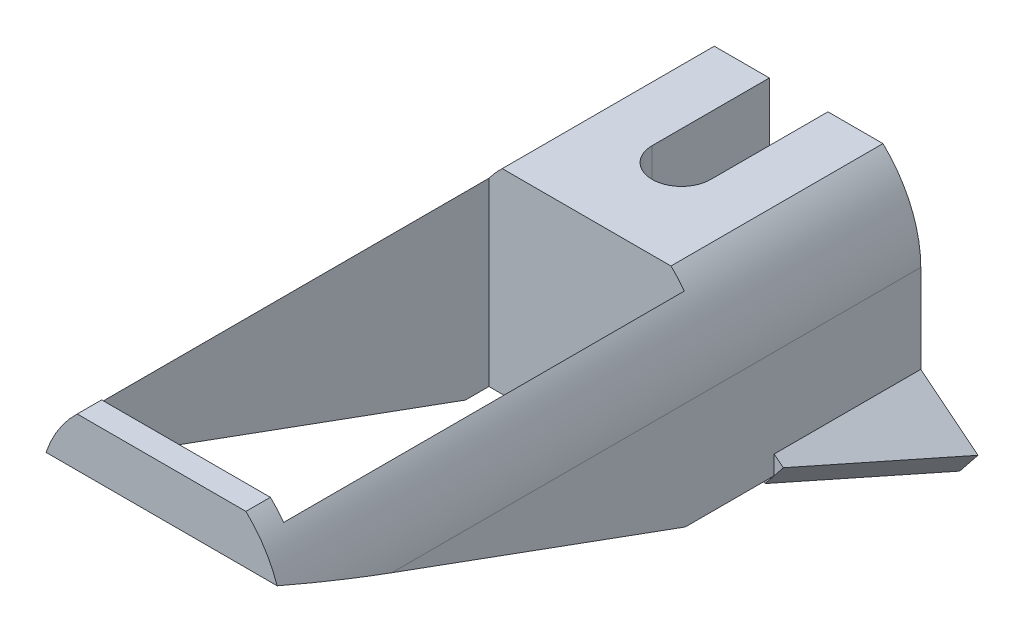
ISO-10303-21;
HEADER;
FILE_DESCRIPTION(('STEP AP214'),'2;1');
FILE_NAME('part.step','',(''),(''),'','','');
FILE_SCHEMA(('AUTOMOTIVE_DESIGN { 1 0 10303 214 1 1 1 1 }'));
ENDSEC;
DATA;
#1=APPLICATION_CONTEXT('core data for automotive mechanical design processes');
#2=APPLICATION_PROTOCOL_DEFINITION('international standard','automotive_design',2000,#1);
#3=PRODUCT_CONTEXT('',#1,'mechanical');
#4=PRODUCT('Part','Part','',(#3));
#5=PRODUCT_RELATED_PRODUCT_CATEGORY('part','',(#4));
#6=PRODUCT_DEFINITION_FORMATION('','',#4);
#7=PRODUCT_DEFINITION_CONTEXT('part definition',#1,'design');
#8=PRODUCT_DEFINITION('design','',#6,#7);
#9=PRODUCT_DEFINITION_SHAPE('','',#8);
#10=(LENGTH_UNIT() NAMED_UNIT(*) SI_UNIT(.MILLI.,.METRE.));
#11=(NAMED_UNIT(*) PLANE_ANGLE_UNIT() SI_UNIT($,.RADIAN.));
#12=(NAMED_UNIT(*) SI_UNIT($,.STERADIAN.) SOLID_ANGLE_UNIT());
#13=UNCERTAINTY_MEASURE_WITH_UNIT(LENGTH_MEASURE(1.E-05),#10,'distance_accuracy_value','');
#14=(GEOMETRIC_REPRESENTATION_CONTEXT(3) GLOBAL_UNCERTAINTY_ASSIGNED_CONTEXT((#13)) GLOBAL_UNIT_ASSIGNED_CONTEXT((#10,
#11,#12)) REPRESENTATION_CONTEXT('',''));
#15=CARTESIAN_POINT('',(0.,0.,0.));
#16=DIRECTION('',(0.,0.,1.));
#17=DIRECTION('',(1.,0.,0.));
#18=AXIS2_PLACEMENT_3D('',#15,#16,#17);
#19=CARTESIAN_POINT('',(0.,20.,21.7));
#20=DIRECTION('',(0.,-1.,0.));
#21=DIRECTION('',(0.,0.,-1.));
#22=AXIS2_PLACEMENT_3D('',#19,#20,#21);
#23=PLANE('',#22);
#24=DIRECTION('',(-1.,0.,0.));
#25=VECTOR('',#24,1.);
#26=CARTESIAN_POINT('',(0.,20.,65.2));
#27=LINE('',#26,#25);
#28=CARTESIAN_POINT('',(21.1334739654613,20.,65.2));
#29=VERTEX_POINT('',#28);
#30=CARTESIAN_POINT('',(3.86652603453867,20.,65.2));
#31=VERTEX_POINT('',#30);
#32=EDGE_CURVE('E419',#29,#31,#27,.T.);
#33=ORIENTED_EDGE('',*,*,#32,.F.);
#34=DIRECTION('',(0.,0.,-1.));
#35=VECTOR('',#34,1.);
#36=CARTESIAN_POINT('',(21.1334739654613,20.,65.201));
#37=LINE('',#36,#35);
#38=CARTESIAN_POINT('',(21.1334739654613,20.,62.7));
#39=VERTEX_POINT('',#38);
#40=EDGE_CURVE('E215',#39,#29,#37,.F.);
#41=ORIENTED_EDGE('',*,*,#40,.F.);
#42=DIRECTION('',(-1.,0.,0.));
#43=VECTOR('',#42,1.);
#44=CARTESIAN_POINT('',(0.,20.,62.7));
#45=LINE('',#44,#43);
#46=CARTESIAN_POINT('',(3.86652603453867,20.,62.7));
#47=VERTEX_POINT('',#46);
#48=EDGE_CURVE('E409',#39,#47,#45,.T.);
#49=ORIENTED_EDGE('',*,*,#48,.T.);
#50=DIRECTION('',(0.,0.,-1.));
#51=VECTOR('',#50,1.);
#52=CARTESIAN_POINT('',(3.86652603453867,20.,65.201));
#53=LINE('',#52,#51);
#54=EDGE_CURVE('E281',#31,#47,#53,.T.);
#55=ORIENTED_EDGE('',*,*,#54,.F.);
#56=EDGE_LOOP('',(#33,#41,#49,#55));
#57=FACE_BOUND('',#56,.T.);
#58=ADVANCED_FACE('F33',(#57),#23,.F.);
#59=CARTESIAN_POINT('',(0.,0.,21.7));
#60=DIRECTION('',(1.,0.,0.));
#61=DIRECTION('',(0.,0.,-1.));
#62=AXIS2_PLACEMENT_3D('',#59,#60,#61);
#63=PLANE('',#62);
#64=DIRECTION('',(0.,0.,1.));
#65=VECTOR('',#64,1.);
#66=CARTESIAN_POINT('',(0.,10.9604686356149,65.201));
#67=LINE('',#66,#65);
#68=CARTESIAN_POINT('',(0.,10.9604686356149,0.));
#69=VERTEX_POINT('',#68);
#70=CARTESIAN_POINT('',(0.,10.9604686356149,54.1316840615849));
#71=VERTEX_POINT('',#70);
#72=EDGE_CURVE('E58',#69,#71,#67,.T.);
#73=ORIENTED_EDGE('',*,*,#72,.F.);
#74=DIRECTION('',(0.,-1.,0.));
#75=VECTOR('',#74,1.);
#76=CARTESIAN_POINT('',(0.,0.,0.));
#77=LINE('',#76,#75);
#78=CARTESIAN_POINT('',(0.,1.92093727122986,0.));
#79=VERTEX_POINT('',#78);
#80=EDGE_CURVE('E253',#69,#79,#77,.T.);
#81=ORIENTED_EDGE('',*,*,#80,.T.);
#82=DIRECTION('',(0.,0.,-1.));
#83=VECTOR('',#82,1.);
#84=CARTESIAN_POINT('',(0.,1.92093727122986,15.));
#85=LINE('',#84,#83);
#86=CARTESIAN_POINT('',(0.,1.92093727122986,15.));
#87=VERTEX_POINT('',#86);
#88=EDGE_CURVE('E327',#87,#79,#85,.T.);
#89=ORIENTED_EDGE('',*,*,#88,.F.);
#90=DIRECTION('',(0.,1.,0.));
#91=VECTOR('',#90,1.);
#92=CARTESIAN_POINT('',(0.,0.,15.));
#93=LINE('',#92,#91);
#94=CARTESIAN_POINT('',(0.,0.,15.));
#95=VERTEX_POINT('',#94);
#96=EDGE_CURVE('E339',#95,#87,#93,.T.);
#97=ORIENTED_EDGE('',*,*,#96,.F.);
#98=DIRECTION('',(0.,0.,-1.));
#99=VECTOR('',#98,1.);
#100=CARTESIAN_POINT('',(0.,0.,21.7));
#101=LINE('',#100,#99);
#102=CARTESIAN_POINT('',(0.,0.,24.1));
#103=VERTEX_POINT('',#102);
#104=EDGE_CURVE('E234',#103,#95,#101,.T.);
#105=ORIENTED_EDGE('',*,*,#104,.F.);
#106=DIRECTION('',(0.,0.34284393312498,0.939392376762444));
#107=VECTOR('',#106,1.);
#108=CARTESIAN_POINT('',(0.,-0.772955945272458,21.9821007099534));
#109=LINE('',#108,#107);
#110=EDGE_CURVE('E384',#103,#71,#109,.T.);
#111=ORIENTED_EDGE('',*,*,#110,.T.);
#112=EDGE_LOOP('',(#73,#81,#89,#97,#105,#111));
#113=FACE_BOUND('',#112,.T.);
#114=ADVANCED_FACE('F35',(#113),#63,.F.);
#115=CARTESIAN_POINT('',(0.,0.,0.));
#116=DIRECTION('',(0.,0.,-1.));
#117=DIRECTION('',(-1.,0.,0.));
#118=AXIS2_PLACEMENT_3D('',#115,#116,#117);
#119=PLANE('',#118);
#120=CARTESIAN_POINT('',(12.5,10.9604686356149,0.));
#121=DIRECTION('',(0.,0.,1.));
#122=DIRECTION('',(-1.,0.,0.));
#123=AXIS2_PLACEMENT_3D('',#120,#121,#122);
#124=CIRCLE('',#123,12.5);
#125=CARTESIAN_POINT('',(3.86652603453867,20.,0.));
#126=VERTEX_POINT('',#125);
#127=EDGE_CURVE('E275',#126,#69,#124,.T.);
#128=ORIENTED_EDGE('',*,*,#127,.F.);
#129=DIRECTION('',(-1.,0.,0.));
#130=VECTOR('',#129,1.);
#131=CARTESIAN_POINT('',(0.,20.,0.));
#132=LINE('',#131,#130);
#133=CARTESIAN_POINT('',(9.49999999999999,20.,0.));
#134=VERTEX_POINT('',#133);
#135=EDGE_CURVE('E240',#134,#126,#132,.T.);
#136=ORIENTED_EDGE('',*,*,#135,.F.);
#137=DIRECTION('',(0.,1.,0.));
#138=VECTOR('',#137,1.);
#139=CARTESIAN_POINT('',(9.49999999999999,0.,0.));
#140=LINE('',#139,#138);
#141=CARTESIAN_POINT('',(9.49999999999999,0.,0.));
#142=VERTEX_POINT('',#141);
#143=EDGE_CURVE('E11',#142,#134,#140,.T.);
#144=ORIENTED_EDGE('',*,*,#143,.F.);
#145=DIRECTION('',(1.,0.,0.));
#146=VECTOR('',#145,1.);
#147=CARTESIAN_POINT('',(0.,0.,0.));
#148=LINE('',#147,#146);
#149=CARTESIAN_POINT('',(2.40117158903732,0.,0.));
#150=VERTEX_POINT('',#149);
#151=EDGE_CURVE('E257',#150,#142,#148,.T.);
#152=ORIENTED_EDGE('',*,*,#151,.F.);
#153=DIRECTION('',(0.78086880944303,0.624695047554424,0.));
#154=VECTOR('',#153,1.);
#155=CARTESIAN_POINT('',(1.87408514266327,-0.421669157099234,0.));
#156=LINE('',#155,#154);
#157=CARTESIAN_POINT('',(-3.98243092815945,-5.10688201375742,0.));
#158=VERTEX_POINT('',#157);
#159=EDGE_CURVE('E320',#158,#150,#156,.T.);
#160=ORIENTED_EDGE('',*,*,#159,.F.);
#161=DIRECTION('',(0.624695047554424,-0.78086880944303,0.));
#162=VECTOR('',#161,1.);
#163=CARTESIAN_POINT('',(-5.85651607082273,-2.76427558542832,0.));
#164=LINE('',#163,#162);
#165=CARTESIAN_POINT('',(-5.85651607082273,-2.76427558542832,0.));
#166=VERTEX_POINT('',#165);
#167=EDGE_CURVE('E330',#166,#158,#164,.T.);
#168=ORIENTED_EDGE('',*,*,#167,.F.);
#169=DIRECTION('',(-0.78086880944303,-0.624695047554424,0.));
#170=VECTOR('',#169,1.);
#171=CARTESIAN_POINT('',(0.,1.92093727122986,0.));
#172=LINE('',#171,#170);
#173=EDGE_CURVE('E324',#79,#166,#172,.T.);
#174=ORIENTED_EDGE('',*,*,#173,.F.);
#175=ORIENTED_EDGE('',*,*,#80,.F.);
#176=EDGE_LOOP('',(#128,#136,#144,#152,#160,#168,#174,#175));
#177=FACE_BOUND('',#176,.T.);
#178=CARTESIAN_POINT('',(2.5,5.,0.));
#179=DIRECTION('',(0.,0.,-1.));
#180=DIRECTION('',(-1.,0.,0.));
#181=AXIS2_PLACEMENT_3D('',#178,#179,#180);
#182=CIRCLE('',#181,2.);
#183=CARTESIAN_POINT('',(0.5,5.,0.));
#184=VERTEX_POINT('',#183);
#185=EDGE_CURVE('E391',#184,#184,#182,.T.);
#186=ORIENTED_EDGE('',*,*,#185,.F.);
#187=EDGE_LOOP('',(#186));
#188=FACE_BOUND('',#187,.T.);
#189=ADVANCED_FACE('F272',(#177,#188),#119,.T.);
#190=CARTESIAN_POINT('',(25.,0.,15.));
#191=DIRECTION('',(0.,0.,-1.));
#192=DIRECTION('',(1.,0.,0.));
#193=AXIS2_PLACEMENT_3D('',#190,#191,#192);
#194=PLANE('',#193);
#195=DIRECTION('',(0.624695047554425,-0.78086880944303,0.));
#196=VECTOR('',#195,1.);
#197=CARTESIAN_POINT('',(-8.43338314198473,10.5417289274809,15.));
#198=LINE('',#197,#196);
#199=CARTESIAN_POINT('',(0.937042571331634,-1.17130321416455,15.));
#200=VERTEX_POINT('',#199);
#201=EDGE_CURVE('E314',#95,#200,#198,.T.);
#202=ORIENTED_EDGE('',*,*,#201,.T.);
#203=DIRECTION('',(0.78086880944303,0.624695047554424,0.));
#204=VECTOR('',#203,1.);
#205=CARTESIAN_POINT('',(1.87408514266327,-0.421669157099234,15.));
#206=LINE('',#205,#204);
#207=CARTESIAN_POINT('',(2.40117158903732,0.,15.));
#208=VERTEX_POINT('',#207);
#209=EDGE_CURVE('E321',#200,#208,#206,.T.);
#210=ORIENTED_EDGE('',*,*,#209,.T.);
#211=DIRECTION('',(-1.,0.,0.));
#212=VECTOR('',#211,1.);
#213=CARTESIAN_POINT('',(0.,0.,15.));
#214=LINE('',#213,#212);
#215=EDGE_CURVE('E477',#208,#95,#214,.T.);
#216=ORIENTED_EDGE('',*,*,#215,.T.);
#217=EDGE_LOOP('',(#202,#210,#216));
#218=FACE_BOUND('',#217,.T.);
#219=ADVANCED_FACE('F673',(#218),#194,.F.);
#220=CARTESIAN_POINT('',(-0.937042571331644,1.17130321416455,15.));
#221=VERTEX_POINT('',#220);
#222=EDGE_CURVE('E317',#221,#95,#198,.T.);
#223=ORIENTED_EDGE('',*,*,#222,.T.);
#224=ORIENTED_EDGE('',*,*,#96,.T.);
#225=DIRECTION('',(-0.78086880944303,-0.624695047554424,0.));
#226=VECTOR('',#225,1.);
#227=CARTESIAN_POINT('',(0.,1.92093727122986,15.));
#228=LINE('',#227,#226);
#229=EDGE_CURVE('E323',#87,#221,#228,.T.);
#230=ORIENTED_EDGE('',*,*,#229,.T.);
#231=EDGE_LOOP('',(#223,#224,#230));
#232=FACE_BOUND('',#231,.T.);
#233=ADVANCED_FACE('F675',(#232),#194,.F.);
#234=CARTESIAN_POINT('',(1.87408514266327,-0.421669157099234,15.));
#235=DIRECTION('',(-0.624695047554424,0.78086880944303,0.));
#236=DIRECTION('',(-0.78086880944303,-0.624695047554424,0.));
#237=AXIS2_PLACEMENT_3D('',#234,#235,#236);
#238=PLANE('',#237);
#239=DIRECTION('',(-0.302377769036027,-0.241902215228822,-0.921982105607361));
#240=VECTOR('',#239,1.);
#241=CARTESIAN_POINT('',(0.937042571331634,-1.17130321416455,15.));
#242=LINE('',#241,#240);
#243=EDGE_CURVE('E311',#200,#158,#242,.T.);
#244=ORIENTED_EDGE('',*,*,#243,.T.);
#245=ORIENTED_EDGE('',*,*,#159,.T.);
#246=DIRECTION('',(0.,0.,1.));
#247=VECTOR('',#246,1.);
#248=CARTESIAN_POINT('',(2.40117158903732,0.,21.7));
#249=LINE('',#248,#247);
#250=EDGE_CURVE('E336',#150,#208,#249,.T.);
#251=ORIENTED_EDGE('',*,*,#250,.T.);
#252=ORIENTED_EDGE('',*,*,#209,.F.);
#253=EDGE_LOOP('',(#244,#245,#251,#252));
#254=FACE_BOUND('',#253,.T.);
#255=ADVANCED_FACE('F541',(#254),#238,.F.);
#256=CARTESIAN_POINT('',(0.,1.92093727122986,15.));
#257=DIRECTION('',(0.624695047554424,-0.78086880944303,0.));
#258=DIRECTION('',(0.78086880944303,0.624695047554425,0.));
#259=AXIS2_PLACEMENT_3D('',#256,#257,#258);
#260=PLANE('',#259);
#261=DIRECTION('',(-0.302377769036027,-0.241902215228822,-0.921982105607362));
#262=VECTOR('',#261,1.);
#263=CARTESIAN_POINT('',(-0.796533977670557,1.28371008909341,15.4284257055423));
#264=LINE('',#263,#262);
#265=EDGE_CURVE('E318',#221,#166,#264,.T.);
#266=ORIENTED_EDGE('',*,*,#265,.F.);
#267=ORIENTED_EDGE('',*,*,#229,.F.);
#268=ORIENTED_EDGE('',*,*,#88,.T.);
#269=ORIENTED_EDGE('',*,*,#173,.T.);
#270=EDGE_LOOP('',(#266,#267,#268,#269));
#271=FACE_BOUND('',#270,.T.);
#272=ADVANCED_FACE('F534',(#271),#260,.F.);
#273=CARTESIAN_POINT('',(0.,0.,21.7));
#274=DIRECTION('',(0.,1.,0.));
#275=DIRECTION('',(0.,0.,1.));
#276=AXIS2_PLACEMENT_3D('',#273,#274,#275);
#277=PLANE('',#276);
#278=CARTESIAN_POINT('',(7.,0.,18.2));
#279=DIRECTION('',(0.,-1.,0.));
#280=DIRECTION('',(0.,0.,-1.));
#281=AXIS2_PLACEMENT_3D('',#278,#279,#280);
#282=CIRCLE('',#281,2.25);
#283=CARTESIAN_POINT('',(7.,0.,15.95));
#284=VERTEX_POINT('',#283);
#285=EDGE_CURVE('E403',#284,#284,#282,.T.);
#286=ORIENTED_EDGE('',*,*,#285,.F.);
#287=EDGE_LOOP('',(#286));
#288=FACE_BOUND('',#287,.T.);
#289=CARTESIAN_POINT('',(18.,0.,18.2));
#290=DIRECTION('',(0.,-1.,0.));
#291=DIRECTION('',(0.,0.,-1.));
#292=AXIS2_PLACEMENT_3D('',#289,#290,#291);
#293=CIRCLE('',#292,2.25);
#294=CARTESIAN_POINT('',(18.,0.,15.95));
#295=VERTEX_POINT('',#294);
#296=EDGE_CURVE('E397',#295,#295,#293,.T.);
#297=ORIENTED_EDGE('',*,*,#296,.F.);
#298=EDGE_LOOP('',(#297));
#299=FACE_BOUND('',#298,.T.);
#300=ORIENTED_EDGE('',*,*,#151,.T.);
#301=DIRECTION('',(0.,0.,-1.));
#302=VECTOR('',#301,1.);
#303=CARTESIAN_POINT('',(9.49999999999999,0.,-11.9912348804847));
#304=LINE('',#303,#302);
#305=CARTESIAN_POINT('',(9.49999999999999,0.,11.9912348804847));
#306=VERTEX_POINT('',#305);
#307=EDGE_CURVE('E303',#306,#142,#304,.T.);
#308=ORIENTED_EDGE('',*,*,#307,.F.);
#309=CARTESIAN_POINT('',(12.5,0.,11.9912348804847));
#310=DIRECTION('',(0.,-1.,0.));
#311=DIRECTION('',(0.,0.,-1.));
#312=AXIS2_PLACEMENT_3D('',#309,#310,#311);
#313=CIRCLE('',#312,3.00000000000001);
#314=CARTESIAN_POINT('',(15.5,0.,11.9912348804847));
#315=VERTEX_POINT('',#314);
#316=EDGE_CURVE('E300',#315,#306,#313,.T.);
#317=ORIENTED_EDGE('',*,*,#316,.F.);
#318=DIRECTION('',(0.,0.,1.));
#319=VECTOR('',#318,1.);
#320=CARTESIAN_POINT('',(15.5,0.,-11.9912348804847));
#321=LINE('',#320,#319);
#322=CARTESIAN_POINT('',(15.5,0.,0.));
#323=VERTEX_POINT('',#322);
#324=EDGE_CURVE('E292',#323,#315,#321,.T.);
#325=ORIENTED_EDGE('',*,*,#324,.F.);
#326=CARTESIAN_POINT('',(22.5988284109627,0.,0.));
#327=VERTEX_POINT('',#326);
#328=EDGE_CURVE('E255',#323,#327,#148,.T.);
#329=ORIENTED_EDGE('',*,*,#328,.T.);
#330=DIRECTION('',(0.,0.,1.));
#331=VECTOR('',#330,1.);
#332=CARTESIAN_POINT('',(22.5988284109627,0.,21.7));
#333=LINE('',#332,#331);
#334=CARTESIAN_POINT('',(22.5988284109627,0.,15.));
#335=VERTEX_POINT('',#334);
#336=EDGE_CURVE('E363',#327,#335,#333,.T.);
#337=ORIENTED_EDGE('',*,*,#336,.T.);
#338=DIRECTION('',(-1.,0.,0.));
#339=VECTOR('',#338,1.);
#340=CARTESIAN_POINT('',(0.,0.,15.));
#341=LINE('',#340,#339);
#342=CARTESIAN_POINT('',(25.,0.,15.));
#343=VERTEX_POINT('',#342);
#344=EDGE_CURVE('E366',#343,#335,#341,.T.);
#345=ORIENTED_EDGE('',*,*,#344,.F.);
#346=DIRECTION('',(0.,0.,-1.));
#347=VECTOR('',#346,1.);
#348=CARTESIAN_POINT('',(25.,0.,21.7));
#349=LINE('',#348,#347);
#350=CARTESIAN_POINT('',(25.,0.,24.1));
#351=VERTEX_POINT('',#350);
#352=EDGE_CURVE('E231',#351,#343,#349,.T.);
#353=ORIENTED_EDGE('',*,*,#352,.F.);
#354=DIRECTION('',(1.,0.,0.));
#355=VECTOR('',#354,1.);
#356=CARTESIAN_POINT('',(-45.,0.,24.1));
#357=LINE('',#356,#355);
#358=CARTESIAN_POINT('',(22.5,0.,24.1));
#359=VERTEX_POINT('',#358);
#360=EDGE_CURVE('E372',#359,#351,#357,.T.);
#361=ORIENTED_EDGE('',*,*,#360,.F.);
#362=DIRECTION('',(0.,0.,-1.));
#363=VECTOR('',#362,1.);
#364=CARTESIAN_POINT('',(22.5,0.,65.2));
#365=LINE('',#364,#363);
#366=CARTESIAN_POINT('',(22.5,0.,21.7));
#367=VERTEX_POINT('',#366);
#368=EDGE_CURVE('E417',#359,#367,#365,.T.);
#369=ORIENTED_EDGE('',*,*,#368,.T.);
#370=DIRECTION('',(1.,0.,0.));
#371=VECTOR('',#370,1.);
#372=CARTESIAN_POINT('',(0.,0.,21.7));
#373=LINE('',#372,#371);
#374=CARTESIAN_POINT('',(2.5,0.,21.7));
#375=VERTEX_POINT('',#374);
#376=EDGE_CURVE('E232',#375,#367,#373,.T.);
#377=ORIENTED_EDGE('',*,*,#376,.F.);
#378=DIRECTION('',(0.,0.,-1.));
#379=VECTOR('',#378,1.);
#380=CARTESIAN_POINT('',(2.5,0.,65.2));
#381=LINE('',#380,#379);
#382=CARTESIAN_POINT('',(2.5,0.,24.1));
#383=VERTEX_POINT('',#382);
#384=EDGE_CURVE('E256',#383,#375,#381,.T.);
#385=ORIENTED_EDGE('',*,*,#384,.F.);
#386=EDGE_CURVE('E377',#103,#383,#357,.T.);
#387=ORIENTED_EDGE('',*,*,#386,.F.);
#388=ORIENTED_EDGE('',*,*,#104,.T.);
#389=ORIENTED_EDGE('',*,*,#215,.F.);
#390=ORIENTED_EDGE('',*,*,#250,.F.);
#391=EDGE_LOOP('',(#300,#308,#317,#325,#329,#337,#345,#353,#361,#369,#377,#385,#387,#388,#389,#390));
#392=FACE_BOUND('',#391,.T.);
#393=ADVANCED_FACE('F431',(#288,#299,#392),#277,.F.);
#394=CARTESIAN_POINT('',(0.,0.,15.));
#395=DIRECTION('',(0.,0.,-1.));
#396=DIRECTION('',(-1.,0.,0.));
#397=AXIS2_PLACEMENT_3D('',#394,#395,#396);
#398=PLANE('',#397);
#399=DIRECTION('',(-0.78086880944303,0.624695047554424,0.));
#400=VECTOR('',#399,1.);
#401=CARTESIAN_POINT('',(23.1259148573367,-0.421669157099234,15.));
#402=LINE('',#401,#400);
#403=CARTESIAN_POINT('',(24.0629574286684,-1.17130321416455,15.));
#404=VERTEX_POINT('',#403);
#405=EDGE_CURVE('E350',#404,#335,#402,.T.);
#406=ORIENTED_EDGE('',*,*,#405,.F.);
#407=DIRECTION('',(-0.624695047554425,-0.78086880944303,0.));
#408=VECTOR('',#407,1.);
#409=CARTESIAN_POINT('',(33.4333831419847,10.5417289274809,15.));
#410=LINE('',#409,#408);
#411=EDGE_CURVE('E344',#343,#404,#410,.T.);
#412=ORIENTED_EDGE('',*,*,#411,.F.);
#413=ORIENTED_EDGE('',*,*,#344,.T.);
#414=EDGE_LOOP('',(#406,#412,#413));
#415=FACE_BOUND('',#414,.T.);
#416=ADVANCED_FACE('F500',(#415),#398,.F.);
#417=CARTESIAN_POINT('',(2.5,20.,65.2));
#418=DIRECTION('',(-1.,0.,0.));
#419=DIRECTION('',(0.,-1.,0.));
#420=AXIS2_PLACEMENT_3D('',#417,#418,#419);
#421=PLANE('',#420);
#422=DIRECTION('',(0.,1.,0.));
#423=VECTOR('',#422,1.);
#424=CARTESIAN_POINT('',(2.5,20.,21.7));
#425=LINE('',#424,#423);
#426=CARTESIAN_POINT('',(2.5,18.4604686356149,21.7));
#427=VERTEX_POINT('',#426);
#428=EDGE_CURVE('E245',#375,#427,#425,.T.);
#429=ORIENTED_EDGE('',*,*,#428,.T.);
#430=DIRECTION('',(0.,0.,-1.));
#431=VECTOR('',#430,1.);
#432=CARTESIAN_POINT('',(2.5,18.4604686356149,65.201));
#433=LINE('',#432,#431);
#434=CARTESIAN_POINT('',(2.5,18.4604686356149,62.7));
#435=VERTEX_POINT('',#434);
#436=EDGE_CURVE('E289',#435,#427,#433,.T.);
#437=ORIENTED_EDGE('',*,*,#436,.F.);
#438=DIRECTION('',(0.,1.,0.));
#439=VECTOR('',#438,1.);
#440=CARTESIAN_POINT('',(2.5,20.,62.7));
#441=LINE('',#440,#439);
#442=CARTESIAN_POINT('',(2.5,14.0875912408759,62.7));
#443=VERTEX_POINT('',#442);
#444=EDGE_CURVE('E413',#443,#435,#441,.T.);
#445=ORIENTED_EDGE('',*,*,#444,.F.);
#446=DIRECTION('',(0.,-0.34284393312498,-0.939392376762444));
#447=VECTOR('',#446,1.);
#448=CARTESIAN_POINT('',(2.5,15.587709812403,66.8103248859843));
#449=LINE('',#448,#447);
#450=EDGE_CURVE('E381',#443,#383,#449,.T.);
#451=ORIENTED_EDGE('',*,*,#450,.T.);
#452=ORIENTED_EDGE('',*,*,#384,.T.);
#453=EDGE_LOOP('',(#429,#437,#445,#451,#452));
#454=FACE_BOUND('',#453,.T.);
#455=ADVANCED_FACE('F427',(#454),#421,.F.);
#456=CARTESIAN_POINT('',(22.5,20.,65.2));
#457=DIRECTION('',(1.,0.,0.));
#458=DIRECTION('',(0.,1.,0.));
#459=AXIS2_PLACEMENT_3D('',#456,#457,#458);
#460=PLANE('',#459);
#461=DIRECTION('',(0.,-1.,0.));
#462=VECTOR('',#461,1.);
#463=CARTESIAN_POINT('',(22.5,20.,62.7));
#464=LINE('',#463,#462);
#465=CARTESIAN_POINT('',(22.5,18.4604686356149,62.7));
#466=VERTEX_POINT('',#465);
#467=CARTESIAN_POINT('',(22.5,14.0875912408759,62.7));
#468=VERTEX_POINT('',#467);
#469=EDGE_CURVE('E439',#466,#468,#464,.T.);
#470=ORIENTED_EDGE('',*,*,#469,.F.);
#471=DIRECTION('',(0.,0.,-1.));
#472=VECTOR('',#471,1.);
#473=CARTESIAN_POINT('',(22.5,18.4604686356149,65.201));
#474=LINE('',#473,#472);
#475=CARTESIAN_POINT('',(22.5,18.4604686356149,21.7));
#476=VERTEX_POINT('',#475);
#477=EDGE_CURVE('E225',#476,#466,#474,.F.);
#478=ORIENTED_EDGE('',*,*,#477,.F.);
#479=DIRECTION('',(0.,-1.,0.));
#480=VECTOR('',#479,1.);
#481=CARTESIAN_POINT('',(22.5,20.,21.7));
#482=LINE('',#481,#480);
#483=EDGE_CURVE('E224',#476,#367,#482,.T.);
#484=ORIENTED_EDGE('',*,*,#483,.T.);
#485=ORIENTED_EDGE('',*,*,#368,.F.);
#486=DIRECTION('',(0.,0.34284393312498,0.939392376762444));
#487=VECTOR('',#486,1.);
#488=CARTESIAN_POINT('',(22.5,15.587709812403,66.8103248859843));
#489=LINE('',#488,#487);
#490=EDGE_CURVE('E376',#359,#468,#489,.T.);
#491=ORIENTED_EDGE('',*,*,#490,.T.);
#492=EDGE_LOOP('',(#470,#478,#484,#485,#491));
#493=FACE_BOUND('',#492,.T.);
#494=ADVANCED_FACE('F438',(#493),#460,.F.);
#495=CARTESIAN_POINT('',(0.,0.,21.7));
#496=DIRECTION('',(0.,0.,-1.));
#497=DIRECTION('',(-1.,0.,0.));
#498=AXIS2_PLACEMENT_3D('',#495,#496,#497);
#499=PLANE('',#498);
#500=ORIENTED_EDGE('',*,*,#483,.F.);
#501=CARTESIAN_POINT('',(12.5,10.9604686356149,21.7));
#502=DIRECTION('',(0.,0.,-1.));
#503=DIRECTION('',(-1.,0.,0.));
#504=AXIS2_PLACEMENT_3D('',#501,#502,#503);
#505=CIRCLE('',#504,12.5);
#506=CARTESIAN_POINT('',(21.1334739654613,20.,21.7));
#507=VERTEX_POINT('',#506);
#508=EDGE_CURVE('E208',#507,#476,#505,.T.);
#509=ORIENTED_EDGE('',*,*,#508,.F.);
#510=DIRECTION('',(-1.,0.,0.));
#511=VECTOR('',#510,1.);
#512=CARTESIAN_POINT('',(0.,20.,21.7));
#513=LINE('',#512,#511);
#514=CARTESIAN_POINT('',(3.86652603453867,20.,21.7));
#515=VERTEX_POINT('',#514);
#516=EDGE_CURVE('E37',#507,#515,#513,.T.);
#517=ORIENTED_EDGE('',*,*,#516,.T.);
#518=CARTESIAN_POINT('',(12.5,10.9604686356149,21.7));
#519=DIRECTION('',(0.,0.,-1.));
#520=DIRECTION('',(-1.,0.,0.));
#521=AXIS2_PLACEMENT_3D('',#518,#519,#520);
#522=CIRCLE('',#521,12.5);
#523=EDGE_CURVE('E290',#427,#515,#522,.T.);
#524=ORIENTED_EDGE('',*,*,#523,.F.);
#525=ORIENTED_EDGE('',*,*,#428,.F.);
#526=ORIENTED_EDGE('',*,*,#376,.T.);
#527=EDGE_LOOP('',(#500,#509,#517,#524,#525,#526));
#528=FACE_BOUND('',#527,.T.);
#529=ADVANCED_FACE('F220',(#528),#499,.F.);
#530=CARTESIAN_POINT('',(25.,0.,21.7));
#531=DIRECTION('',(-1.,0.,0.));
#532=DIRECTION('',(0.,0.,1.));
#533=AXIS2_PLACEMENT_3D('',#530,#531,#532);
#534=PLANE('',#533);
#535=DIRECTION('',(0.,1.,0.));
#536=VECTOR('',#535,1.);
#537=CARTESIAN_POINT('',(25.,0.,0.));
#538=LINE('',#537,#536);
#539=CARTESIAN_POINT('',(25.,1.92093727122986,0.));
#540=VERTEX_POINT('',#539);
#541=CARTESIAN_POINT('',(25.,10.9604686356149,0.));
#542=VERTEX_POINT('',#541);
#543=EDGE_CURVE('E260',#540,#542,#538,.T.);
#544=ORIENTED_EDGE('',*,*,#543,.T.);
#545=DIRECTION('',(0.,0.,-1.));
#546=VECTOR('',#545,1.);
#547=CARTESIAN_POINT('',(25.,10.9604686356149,65.201));
#548=LINE('',#547,#546);
#549=CARTESIAN_POINT('',(25.,10.9604686356149,54.1316840615849));
#550=VERTEX_POINT('',#549);
#551=EDGE_CURVE('E216',#550,#542,#548,.T.);
#552=ORIENTED_EDGE('',*,*,#551,.F.);
#553=DIRECTION('',(0.,0.34284393312498,0.939392376762444));
#554=VECTOR('',#553,1.);
#555=CARTESIAN_POINT('',(25.,0.,24.1));
#556=LINE('',#555,#554);
#557=EDGE_CURVE('E369',#351,#550,#556,.T.);
#558=ORIENTED_EDGE('',*,*,#557,.F.);
#559=ORIENTED_EDGE('',*,*,#352,.T.);
#560=DIRECTION('',(0.,-1.,0.));
#561=VECTOR('',#560,1.);
#562=CARTESIAN_POINT('',(25.,0.,15.));
#563=LINE('',#562,#561);
#564=CARTESIAN_POINT('',(25.,1.92093727122986,15.));
#565=VERTEX_POINT('',#564);
#566=EDGE_CURVE('E469',#565,#343,#563,.T.);
#567=ORIENTED_EDGE('',*,*,#566,.F.);
#568=DIRECTION('',(0.,0.,-1.));
#569=VECTOR('',#568,1.);
#570=CARTESIAN_POINT('',(25.,1.92093727122986,15.));
#571=LINE('',#570,#569);
#572=EDGE_CURVE('E353',#565,#540,#571,.T.);
#573=ORIENTED_EDGE('',*,*,#572,.T.);
#574=EDGE_LOOP('',(#544,#552,#558,#559,#567,#573));
#575=FACE_BOUND('',#574,.T.);
#576=ADVANCED_FACE('F512',(#575),#534,.F.);
#577=ORIENTED_EDGE('',*,*,#516,.F.);
#578=CARTESIAN_POINT('',(21.1334739654613,20.,0.));
#579=VERTEX_POINT('',#578);
#580=EDGE_CURVE('E205',#579,#507,#37,.F.);
#581=ORIENTED_EDGE('',*,*,#580,.F.);
#582=CARTESIAN_POINT('',(15.5,20.,0.));
#583=VERTEX_POINT('',#582);
#584=EDGE_CURVE('E236',#579,#583,#132,.T.);
#585=ORIENTED_EDGE('',*,*,#584,.T.);
#586=DIRECTION('',(0.,0.,-1.));
#587=VECTOR('',#586,1.);
#588=CARTESIAN_POINT('',(15.5,20.,-11.9912348804847));
#589=LINE('',#588,#587);
#590=CARTESIAN_POINT('',(15.5,20.,11.9912348804847));
#591=VERTEX_POINT('',#590);
#592=EDGE_CURVE('E298',#591,#583,#589,.T.);
#593=ORIENTED_EDGE('',*,*,#592,.F.);
#594=CARTESIAN_POINT('',(12.5,20.,11.9912348804847));
#595=DIRECTION('',(0.,-1.,0.));
#596=DIRECTION('',(0.,0.,-1.));
#597=AXIS2_PLACEMENT_3D('',#594,#595,#596);
#598=CIRCLE('',#597,3.00000000000001);
#599=CARTESIAN_POINT('',(9.49999999999999,20.,11.9912348804847));
#600=VERTEX_POINT('',#599);
#601=EDGE_CURVE('E294',#600,#591,#598,.F.);
#602=ORIENTED_EDGE('',*,*,#601,.F.);
#603=DIRECTION('',(0.,0.,1.));
#604=VECTOR('',#603,1.);
#605=CARTESIAN_POINT('',(9.49999999999999,20.,-11.9912348804847));
#606=LINE('',#605,#604);
#607=EDGE_CURVE('E268',#134,#600,#606,.T.);
#608=ORIENTED_EDGE('',*,*,#607,.F.);
#609=ORIENTED_EDGE('',*,*,#135,.T.);
#610=EDGE_CURVE('E230',#515,#126,#53,.T.);
#611=ORIENTED_EDGE('',*,*,#610,.F.);
#612=EDGE_LOOP('',(#577,#581,#585,#593,#602,#608,#609,#611));
#613=FACE_BOUND('',#612,.T.);
#614=ADVANCED_FACE('F228',(#613),#23,.F.);
#615=CARTESIAN_POINT('',(12.5,10.9604686356149,0.));
#616=DIRECTION('',(0.,0.,1.));
#617=DIRECTION('',(-1.,0.,0.));
#618=AXIS2_PLACEMENT_3D('',#615,#616,#617);
#619=CIRCLE('',#618,12.5);
#620=EDGE_CURVE('E211',#542,#579,#619,.T.);
#621=ORIENTED_EDGE('',*,*,#620,.F.);
#622=ORIENTED_EDGE('',*,*,#543,.F.);
#623=DIRECTION('',(0.78086880944303,-0.624695047554424,0.));
#624=VECTOR('',#623,1.);
#625=CARTESIAN_POINT('',(25.,1.92093727122986,0.));
#626=LINE('',#625,#624);
#627=CARTESIAN_POINT('',(30.8565160708227,-2.76427558542832,0.));
#628=VERTEX_POINT('',#627);
#629=EDGE_CURVE('E354',#540,#628,#626,.T.);
#630=ORIENTED_EDGE('',*,*,#629,.T.);
#631=DIRECTION('',(-0.624695047554424,-0.78086880944303,0.));
#632=VECTOR('',#631,1.);
#633=CARTESIAN_POINT('',(30.8565160708227,-2.76427558542832,0.));
#634=LINE('',#633,#632);
#635=CARTESIAN_POINT('',(28.9824309281595,-5.10688201375742,0.));
#636=VERTEX_POINT('',#635);
#637=EDGE_CURVE('E357',#628,#636,#634,.T.);
#638=ORIENTED_EDGE('',*,*,#637,.T.);
#639=DIRECTION('',(-0.78086880944303,0.624695047554424,0.));
#640=VECTOR('',#639,1.);
#641=CARTESIAN_POINT('',(23.1259148573367,-0.421669157099234,0.));
#642=LINE('',#641,#640);
#643=EDGE_CURVE('E351',#636,#327,#642,.T.);
#644=ORIENTED_EDGE('',*,*,#643,.T.);
#645=ORIENTED_EDGE('',*,*,#328,.F.);
#646=DIRECTION('',(0.,-1.,0.));
#647=VECTOR('',#646,1.);
#648=CARTESIAN_POINT('',(15.5,0.,0.));
#649=LINE('',#648,#647);
#650=EDGE_CURVE('E43',#583,#323,#649,.T.);
#651=ORIENTED_EDGE('',*,*,#650,.F.);
#652=ORIENTED_EDGE('',*,*,#584,.F.);
#653=EDGE_LOOP('',(#621,#622,#630,#638,#644,#645,#651,#652));
#654=FACE_BOUND('',#653,.T.);
#655=CARTESIAN_POINT('',(22.5,5.,0.));
#656=DIRECTION('',(0.,0.,-1.));
#657=DIRECTION('',(-1.,0.,0.));
#658=AXIS2_PLACEMENT_3D('',#655,#656,#657);
#659=CIRCLE('',#658,2.);
#660=CARTESIAN_POINT('',(20.5,5.,0.));
#661=VERTEX_POINT('',#660);
#662=EDGE_CURVE('E387',#661,#661,#659,.T.);
#663=ORIENTED_EDGE('',*,*,#662,.F.);
#664=EDGE_LOOP('',(#663));
#665=FACE_BOUND('',#664,.T.);
#666=ADVANCED_FACE('F490',(#654,#665),#119,.T.);
#667=CARTESIAN_POINT('',(0.,0.,65.2));
#668=DIRECTION('',(0.,0.,1.));
#669=DIRECTION('',(1.,0.,0.));
#670=AXIS2_PLACEMENT_3D('',#667,#668,#669);
#671=PLANE('',#670);
#672=CARTESIAN_POINT('',(12.5,10.9604686356149,65.2));
#673=DIRECTION('',(0.,0.,1.));
#674=DIRECTION('',(1.,0.,0.));
#675=AXIS2_PLACEMENT_3D('',#672,#673,#674);
#676=CIRCLE('',#675,12.5);
#677=CARTESIAN_POINT('',(24.3292935696156,15.,65.2));
#678=VERTEX_POINT('',#677);
#679=EDGE_CURVE('E50',#678,#29,#676,.T.);
#680=ORIENTED_EDGE('',*,*,#679,.T.);
#681=ORIENTED_EDGE('',*,*,#32,.T.);
#682=CARTESIAN_POINT('',(12.5,10.9604686356149,65.2));
#683=DIRECTION('',(0.,0.,1.));
#684=DIRECTION('',(1.,0.,0.));
#685=AXIS2_PLACEMENT_3D('',#682,#683,#684);
#686=CIRCLE('',#685,12.5);
#687=CARTESIAN_POINT('',(0.670706430384388,15.,65.2));
#688=VERTEX_POINT('',#687);
#689=EDGE_CURVE('E279',#31,#688,#686,.T.);
#690=ORIENTED_EDGE('',*,*,#689,.T.);
#691=DIRECTION('',(1.,0.,0.));
#692=VECTOR('',#691,1.);
#693=CARTESIAN_POINT('',(-45.,15.,65.2));
#694=LINE('',#693,#692);
#695=EDGE_CURVE('E373',#688,#678,#694,.T.);
#696=ORIENTED_EDGE('',*,*,#695,.T.);
#697=EDGE_LOOP('',(#680,#681,#690,#696));
#698=FACE_BOUND('',#697,.T.);
#699=ADVANCED_FACE('F515',(#698),#671,.T.);
#700=CARTESIAN_POINT('',(0.,0.,62.7));
#701=DIRECTION('',(0.,0.,1.));
#702=DIRECTION('',(1.,0.,0.));
#703=AXIS2_PLACEMENT_3D('',#700,#701,#702);
#704=PLANE('',#703);
#705=ORIENTED_EDGE('',*,*,#48,.F.);
#706=CARTESIAN_POINT('',(12.5,10.9604686356149,62.7));
#707=DIRECTION('',(0.,0.,1.));
#708=DIRECTION('',(1.,0.,0.));
#709=AXIS2_PLACEMENT_3D('',#706,#707,#708);
#710=CIRCLE('',#709,12.5);
#711=EDGE_CURVE('E441',#466,#39,#710,.T.);
#712=ORIENTED_EDGE('',*,*,#711,.F.);
#713=ORIENTED_EDGE('',*,*,#469,.T.);
#714=DIRECTION('',(-1.,0.,0.));
#715=VECTOR('',#714,1.);
#716=CARTESIAN_POINT('',(0.,14.0875912408759,62.7));
#717=LINE('',#716,#715);
#718=EDGE_CURVE('E459',#468,#443,#717,.T.);
#719=ORIENTED_EDGE('',*,*,#718,.T.);
#720=ORIENTED_EDGE('',*,*,#444,.T.);
#721=CARTESIAN_POINT('',(12.5,10.9604686356149,62.7));
#722=DIRECTION('',(0.,0.,1.));
#723=DIRECTION('',(1.,0.,0.));
#724=AXIS2_PLACEMENT_3D('',#721,#722,#723);
#725=CIRCLE('',#724,12.5);
#726=EDGE_CURVE('E287',#47,#435,#725,.T.);
#727=ORIENTED_EDGE('',*,*,#726,.F.);
#728=EDGE_LOOP('',(#705,#712,#713,#719,#720,#727));
#729=FACE_BOUND('',#728,.T.);
#730=ADVANCED_FACE('F456',(#729),#704,.F.);
#731=CARTESIAN_POINT('',(7.,10.,18.2));
#732=DIRECTION('',(0.,-1.,0.));
#733=DIRECTION('',(0.,0.,-1.));
#734=AXIS2_PLACEMENT_3D('',#731,#732,#733);
#735=CYLINDRICAL_SURFACE('',#734,2.25);
#736=CARTESIAN_POINT('',(7.,10.,18.2));
#737=DIRECTION('',(0.,-1.,0.));
#738=DIRECTION('',(0.,0.,-1.));
#739=AXIS2_PLACEMENT_3D('',#736,#737,#738);
#740=CIRCLE('',#739,2.25);
#741=CARTESIAN_POINT('',(7.,10.,15.95));
#742=VERTEX_POINT('',#741);
#743=EDGE_CURVE('E406',#742,#742,#740,.T.);
#744=ORIENTED_EDGE('',*,*,#743,.F.);
#745=EDGE_LOOP('',(#744));
#746=FACE_BOUND('',#745,.T.);
#747=ORIENTED_EDGE('',*,*,#285,.T.);
#748=EDGE_LOOP('',(#747));
#749=FACE_BOUND('',#748,.T.);
#750=ADVANCED_FACE('F561',(#746,#749),#735,.F.);
#751=CARTESIAN_POINT('',(7.,10.,18.2));
#752=DIRECTION('',(0.,-1.,0.));
#753=DIRECTION('',(0.,0.,-1.));
#754=AXIS2_PLACEMENT_3D('',#751,#752,#753);
#755=PLANE('',#754);
#756=ORIENTED_EDGE('',*,*,#743,.T.);
#757=EDGE_LOOP('',(#756));
#758=FACE_BOUND('',#757,.T.);
#759=ADVANCED_FACE('F551',(#758),#755,.T.);
#760=CARTESIAN_POINT('',(18.,10.,18.2));
#761=DIRECTION('',(0.,-1.,0.));
#762=DIRECTION('',(0.,0.,-1.));
#763=AXIS2_PLACEMENT_3D('',#760,#761,#762);
#764=CYLINDRICAL_SURFACE('',#763,2.25);
#765=CARTESIAN_POINT('',(18.,10.,18.2));
#766=DIRECTION('',(0.,-1.,0.));
#767=DIRECTION('',(0.,0.,-1.));
#768=AXIS2_PLACEMENT_3D('',#765,#766,#767);
#769=CIRCLE('',#768,2.25);
#770=CARTESIAN_POINT('',(18.,10.,15.95));
#771=VERTEX_POINT('',#770);
#772=EDGE_CURVE('E400',#771,#771,#769,.T.);
#773=ORIENTED_EDGE('',*,*,#772,.F.);
#774=EDGE_LOOP('',(#773));
#775=FACE_BOUND('',#774,.T.);
#776=ORIENTED_EDGE('',*,*,#296,.T.);
#777=EDGE_LOOP('',(#776));
#778=FACE_BOUND('',#777,.T.);
#779=ADVANCED_FACE('F548',(#775,#778),#764,.F.);
#780=CARTESIAN_POINT('',(18.,10.,18.2));
#781=DIRECTION('',(0.,-1.,0.));
#782=DIRECTION('',(0.,0.,-1.));
#783=AXIS2_PLACEMENT_3D('',#780,#781,#782);
#784=PLANE('',#783);
#785=ORIENTED_EDGE('',*,*,#772,.T.);
#786=EDGE_LOOP('',(#785));
#787=FACE_BOUND('',#786,.T.);
#788=ADVANCED_FACE('F550',(#787),#784,.T.);
#789=CARTESIAN_POINT('',(2.5,5.,10.));
#790=DIRECTION('',(0.,0.,-1.));
#791=DIRECTION('',(-1.,0.,0.));
#792=AXIS2_PLACEMENT_3D('',#789,#790,#791);
#793=CYLINDRICAL_SURFACE('',#792,2.);
#794=CARTESIAN_POINT('',(2.5,5.,10.));
#795=DIRECTION('',(0.,0.,-1.));
#796=DIRECTION('',(-1.,0.,0.));
#797=AXIS2_PLACEMENT_3D('',#794,#795,#796);
#798=CIRCLE('',#797,2.);
#799=CARTESIAN_POINT('',(0.5,5.,10.));
#800=VERTEX_POINT('',#799);
#801=EDGE_CURVE('E394',#800,#800,#798,.T.);
#802=ORIENTED_EDGE('',*,*,#801,.F.);
#803=EDGE_LOOP('',(#802));
#804=FACE_BOUND('',#803,.T.);
#805=ORIENTED_EDGE('',*,*,#185,.T.);
#806=EDGE_LOOP('',(#805));
#807=FACE_BOUND('',#806,.T.);
#808=ADVANCED_FACE('F558',(#804,#807),#793,.F.);
#809=CARTESIAN_POINT('',(2.5,5.,10.));
#810=DIRECTION('',(0.,0.,-1.));
#811=DIRECTION('',(-1.,0.,0.));
#812=AXIS2_PLACEMENT_3D('',#809,#810,#811);
#813=PLANE('',#812);
#814=ORIENTED_EDGE('',*,*,#801,.T.);
#815=EDGE_LOOP('',(#814));
#816=FACE_BOUND('',#815,.T.);
#817=ADVANCED_FACE('F692',(#816),#813,.T.);
#818=CARTESIAN_POINT('',(22.5,5.,10.));
#819=DIRECTION('',(0.,0.,-1.));
#820=DIRECTION('',(-1.,0.,0.));
#821=AXIS2_PLACEMENT_3D('',#818,#819,#820);
#822=CYLINDRICAL_SURFACE('',#821,2.);
#823=CARTESIAN_POINT('',(22.5,5.,10.));
#824=DIRECTION('',(0.,0.,-1.));
#825=DIRECTION('',(-1.,0.,0.));
#826=AXIS2_PLACEMENT_3D('',#823,#824,#825);
#827=CIRCLE('',#826,2.);
#828=CARTESIAN_POINT('',(20.5,5.,10.));
#829=VERTEX_POINT('',#828);
#830=EDGE_CURVE('E388',#829,#829,#827,.T.);
#831=ORIENTED_EDGE('',*,*,#830,.F.);
#832=EDGE_LOOP('',(#831));
#833=FACE_BOUND('',#832,.T.);
#834=ORIENTED_EDGE('',*,*,#662,.T.);
#835=EDGE_LOOP('',(#834));
#836=FACE_BOUND('',#835,.T.);
#837=ADVANCED_FACE('F688',(#833,#836),#822,.F.);
#838=CARTESIAN_POINT('',(22.5,5.,10.));
#839=DIRECTION('',(0.,0.,-1.));
#840=DIRECTION('',(-1.,0.,0.));
#841=AXIS2_PLACEMENT_3D('',#838,#839,#840);
#842=PLANE('',#841);
#843=ORIENTED_EDGE('',*,*,#830,.T.);
#844=EDGE_LOOP('',(#843));
#845=FACE_BOUND('',#844,.T.);
#846=ADVANCED_FACE('F634',(#845),#842,.T.);
#847=CARTESIAN_POINT('',(-45.,0.,24.1));
#848=DIRECTION('',(0.,0.939392376762444,-0.34284393312498));
#849=DIRECTION('',(0.,0.34284393312498,0.939392376762444));
#850=AXIS2_PLACEMENT_3D('',#847,#848,#849);
#851=PLANE('',#850);
#852=ORIENTED_EDGE('',*,*,#557,.T.);
#853=CARTESIAN_POINT('',(12.5,10.9604686356149,54.1316840615849));
#854=DIRECTION('',(0.,0.939392376762444,-0.34284393312498));
#855=DIRECTION('',(0.,-0.34284393312498,-0.939392376762444));
#856=AXIS2_PLACEMENT_3D('',#853,#854,#855);
#857=ELLIPSE('',#856,36.459738068176,12.5);
#858=EDGE_CURVE('E445',#678,#550,#857,.T.);
#859=ORIENTED_EDGE('',*,*,#858,.F.);
#860=ORIENTED_EDGE('',*,*,#695,.F.);
#861=CARTESIAN_POINT('',(12.5,10.9604686356149,54.1316840615849));
#862=DIRECTION('',(0.,0.939392376762444,-0.34284393312498));
#863=DIRECTION('',(0.,-0.34284393312498,-0.939392376762444));
#864=AXIS2_PLACEMENT_3D('',#861,#862,#863);
#865=ELLIPSE('',#864,36.459738068176,12.5);
#866=EDGE_CURVE('E277',#71,#688,#865,.T.);
#867=ORIENTED_EDGE('',*,*,#866,.F.);
#868=ORIENTED_EDGE('',*,*,#110,.F.);
#869=ORIENTED_EDGE('',*,*,#386,.T.);
#870=ORIENTED_EDGE('',*,*,#450,.F.);
#871=ORIENTED_EDGE('',*,*,#718,.F.);
#872=ORIENTED_EDGE('',*,*,#490,.F.);
#873=ORIENTED_EDGE('',*,*,#360,.T.);
#874=EDGE_LOOP('',(#852,#859,#860,#867,#868,#869,#870,#871,#872,#873));
#875=FACE_BOUND('',#874,.T.);
#876=ADVANCED_FACE('F461',(#875),#851,.F.);
#877=ORIENTED_EDGE('',*,*,#566,.T.);
#878=CARTESIAN_POINT('',(25.9370425713316,1.17130321416455,15.));
#879=VERTEX_POINT('',#878);
#880=EDGE_CURVE('E346',#879,#343,#410,.T.);
#881=ORIENTED_EDGE('',*,*,#880,.F.);
#882=DIRECTION('',(0.78086880944303,-0.624695047554424,0.));
#883=VECTOR('',#882,1.);
#884=CARTESIAN_POINT('',(25.,1.92093727122986,15.));
#885=LINE('',#884,#883);
#886=EDGE_CURVE('E347',#565,#879,#885,.T.);
#887=ORIENTED_EDGE('',*,*,#886,.F.);
#888=EDGE_LOOP('',(#877,#881,#887));
#889=FACE_BOUND('',#888,.T.);
#890=ADVANCED_FACE('F507',(#889),#398,.F.);
#891=CARTESIAN_POINT('',(23.1259148573367,-0.421669157099234,15.));
#892=DIRECTION('',(-0.624695047554424,-0.78086880944303,0.));
#893=DIRECTION('',(0.78086880944303,-0.624695047554424,0.));
#894=AXIS2_PLACEMENT_3D('',#891,#892,#893);
#895=PLANE('',#894);
#896=DIRECTION('',(0.302377769036027,-0.241902215228822,-0.921982105607361));
#897=VECTOR('',#896,1.);
#898=CARTESIAN_POINT('',(24.0629574286684,-1.17130321416455,15.));
#899=LINE('',#898,#897);
#900=EDGE_CURVE('E342',#404,#636,#899,.T.);
#901=ORIENTED_EDGE('',*,*,#900,.F.);
#902=ORIENTED_EDGE('',*,*,#405,.T.);
#903=ORIENTED_EDGE('',*,*,#336,.F.);
#904=ORIENTED_EDGE('',*,*,#643,.F.);
#905=EDGE_LOOP('',(#901,#902,#903,#904));
#906=FACE_BOUND('',#905,.T.);
#907=ADVANCED_FACE('F495',(#906),#895,.T.);
#908=CARTESIAN_POINT('',(25.,1.92093727122986,15.));
#909=DIRECTION('',(0.624695047554424,0.78086880944303,0.));
#910=DIRECTION('',(-0.78086880944303,0.624695047554425,0.));
#911=AXIS2_PLACEMENT_3D('',#908,#909,#910);
#912=PLANE('',#911);
#913=DIRECTION('',(-0.302377769036027,0.241902215228822,0.921982105607362));
#914=VECTOR('',#913,1.);
#915=CARTESIAN_POINT('',(25.7965339776706,1.28371008909342,15.4284257055423));
#916=LINE('',#915,#914);
#917=EDGE_CURVE('E475',#628,#879,#916,.T.);
#918=ORIENTED_EDGE('',*,*,#917,.F.);
#919=ORIENTED_EDGE('',*,*,#629,.F.);
#920=ORIENTED_EDGE('',*,*,#572,.F.);
#921=ORIENTED_EDGE('',*,*,#886,.T.);
#922=EDGE_LOOP('',(#918,#919,#920,#921));
#923=FACE_BOUND('',#922,.T.);
#924=ADVANCED_FACE('F510',(#923),#912,.T.);
#925=CARTESIAN_POINT('',(33.4333831419847,10.5417289274809,15.));
#926=DIRECTION('',(-0.719947069133398,0.575957655306719,-0.387232484355091));
#927=DIRECTION('',(-0.624695047554425,-0.78086880944303,0.));
#928=AXIS2_PLACEMENT_3D('',#925,#926,#927);
#929=PLANE('',#928);
#930=ORIENTED_EDGE('',*,*,#917,.T.);
#931=ORIENTED_EDGE('',*,*,#880,.T.);
#932=ORIENTED_EDGE('',*,*,#411,.T.);
#933=ORIENTED_EDGE('',*,*,#900,.T.);
#934=ORIENTED_EDGE('',*,*,#637,.F.);
#935=EDGE_LOOP('',(#930,#931,#932,#933,#934));
#936=FACE_BOUND('',#935,.T.);
#937=ADVANCED_FACE('F502',(#936),#929,.F.);
#938=CARTESIAN_POINT('',(-8.43338314198473,10.5417289274809,15.));
#939=DIRECTION('',(-0.719947069133398,-0.575957655306719,0.387232484355091));
#940=DIRECTION('',(0.624695047554425,-0.78086880944303,0.));
#941=AXIS2_PLACEMENT_3D('',#938,#939,#940);
#942=PLANE('',#941);
#943=ORIENTED_EDGE('',*,*,#265,.T.);
#944=ORIENTED_EDGE('',*,*,#167,.T.);
#945=ORIENTED_EDGE('',*,*,#243,.F.);
#946=ORIENTED_EDGE('',*,*,#201,.F.);
#947=ORIENTED_EDGE('',*,*,#222,.F.);
#948=EDGE_LOOP('',(#943,#944,#945,#946,#947));
#949=FACE_BOUND('',#948,.T.);
#950=ADVANCED_FACE('F664',(#949),#942,.T.);
#951=CARTESIAN_POINT('',(9.49999999999999,50.5769274611993,-11.9912348804847));
#952=DIRECTION('',(-1.,0.,0.));
#953=DIRECTION('',(0.,0.,1.));
#954=AXIS2_PLACEMENT_3D('',#951,#952,#953);
#955=PLANE('',#954);
#956=ORIENTED_EDGE('',*,*,#143,.T.);
#957=ORIENTED_EDGE('',*,*,#607,.T.);
#958=DIRECTION('',(0.,-1.,0.));
#959=VECTOR('',#958,1.);
#960=CARTESIAN_POINT('',(9.49999999999999,50.5769274611993,11.9912348804847));
#961=LINE('',#960,#959);
#962=EDGE_CURVE('E296',#600,#306,#961,.T.);
#963=ORIENTED_EDGE('',*,*,#962,.T.);
#964=ORIENTED_EDGE('',*,*,#307,.T.);
#965=EDGE_LOOP('',(#956,#957,#963,#964));
#966=FACE_BOUND('',#965,.T.);
#967=ADVANCED_FACE('F660',(#966),#955,.F.);
#968=CARTESIAN_POINT('',(12.5,50.5769274611993,11.9912348804847));
#969=DIRECTION('',(0.,-1.,0.));
#970=DIRECTION('',(0.,0.,-1.));
#971=AXIS2_PLACEMENT_3D('',#968,#969,#970);
#972=CYLINDRICAL_SURFACE('',#971,3.00000000000001);
#973=ORIENTED_EDGE('',*,*,#601,.T.);
#974=DIRECTION('',(0.,-1.,0.));
#975=VECTOR('',#974,1.);
#976=CARTESIAN_POINT('',(15.5,50.5769274611993,11.9912348804847));
#977=LINE('',#976,#975);
#978=EDGE_CURVE('E305',#591,#315,#977,.T.);
#979=ORIENTED_EDGE('',*,*,#978,.T.);
#980=ORIENTED_EDGE('',*,*,#316,.T.);
#981=ORIENTED_EDGE('',*,*,#962,.F.);
#982=EDGE_LOOP('',(#973,#979,#980,#981));
#983=FACE_BOUND('',#982,.T.);
#984=ADVANCED_FACE('F663',(#983),#972,.F.);
#985=CARTESIAN_POINT('',(15.5,50.5769274611993,-11.9912348804847));
#986=DIRECTION('',(1.,0.,0.));
#987=DIRECTION('',(0.,0.,-1.));
#988=AXIS2_PLACEMENT_3D('',#985,#986,#987);
#989=PLANE('',#988);
#990=ORIENTED_EDGE('',*,*,#650,.T.);
#991=ORIENTED_EDGE('',*,*,#324,.T.);
#992=ORIENTED_EDGE('',*,*,#978,.F.);
#993=ORIENTED_EDGE('',*,*,#592,.T.);
#994=EDGE_LOOP('',(#990,#991,#992,#993));
#995=FACE_BOUND('',#994,.T.);
#996=ADVANCED_FACE('F482',(#995),#989,.F.);
#997=CARTESIAN_POINT('',(12.5,10.9604686356149,65.201));
#998=DIRECTION('',(0.,0.,-1.));
#999=DIRECTION('',(-1.,0.,0.));
#1000=AXIS2_PLACEMENT_3D('',#997,#998,#999);
#1001=CYLINDRICAL_SURFACE('',#1000,12.5);
#1002=ORIENTED_EDGE('',*,*,#610,.T.);
#1003=ORIENTED_EDGE('',*,*,#127,.T.);
#1004=ORIENTED_EDGE('',*,*,#72,.T.);
#1005=ORIENTED_EDGE('',*,*,#866,.T.);
#1006=ORIENTED_EDGE('',*,*,#689,.F.);
#1007=ORIENTED_EDGE('',*,*,#54,.T.);
#1008=ORIENTED_EDGE('',*,*,#726,.T.);
#1009=ORIENTED_EDGE('',*,*,#436,.T.);
#1010=ORIENTED_EDGE('',*,*,#523,.T.);
#1011=EDGE_LOOP('',(#1002,#1003,#1004,#1005,#1006,#1007,#1008,#1009,#1010));
#1012=FACE_BOUND('',#1011,.T.);
#1013=ADVANCED_FACE('F452',(#1012),#1001,.T.);
#1014=CARTESIAN_POINT('',(12.5,10.9604686356149,65.201));
#1015=DIRECTION('',(0.,0.,-1.));
#1016=DIRECTION('',(-1.,0.,0.));
#1017=AXIS2_PLACEMENT_3D('',#1014,#1015,#1016);
#1018=CYLINDRICAL_SURFACE('',#1017,12.5);
#1019=ORIENTED_EDGE('',*,*,#580,.T.);
#1020=ORIENTED_EDGE('',*,*,#508,.T.);
#1021=ORIENTED_EDGE('',*,*,#477,.T.);
#1022=ORIENTED_EDGE('',*,*,#711,.T.);
#1023=ORIENTED_EDGE('',*,*,#40,.T.);
#1024=ORIENTED_EDGE('',*,*,#679,.F.);
#1025=ORIENTED_EDGE('',*,*,#858,.T.);
#1026=ORIENTED_EDGE('',*,*,#551,.T.);
#1027=ORIENTED_EDGE('',*,*,#620,.T.);
#1028=EDGE_LOOP('',(#1019,#1020,#1021,#1022,#1023,#1024,#1025,#1026,#1027));
#1029=FACE_BOUND('',#1028,.T.);
#1030=ADVANCED_FACE('F207',(#1029),#1018,.T.);
#1031=CLOSED_SHELL('',(#58,#114,#189,#219,#233,#255,#272,#393,#416,#455,#494,#529,#576,#614,
#666,#699,#730,#750,#759,#779,#788,#808,#817,#837,#846,#876,#890,#907,#924,#937,#950,#967,#984,
#996,#1013,#1030));
#1032=MANIFOLD_SOLID_BREP('B2',#1031);
#1033=ADVANCED_BREP_SHAPE_REPRESENTATION('',(#18,#1032),#14);
#1034=SHAPE_DEFINITION_REPRESENTATION(#9,#1033);
ENDSEC;
END-ISO-10303-21;
